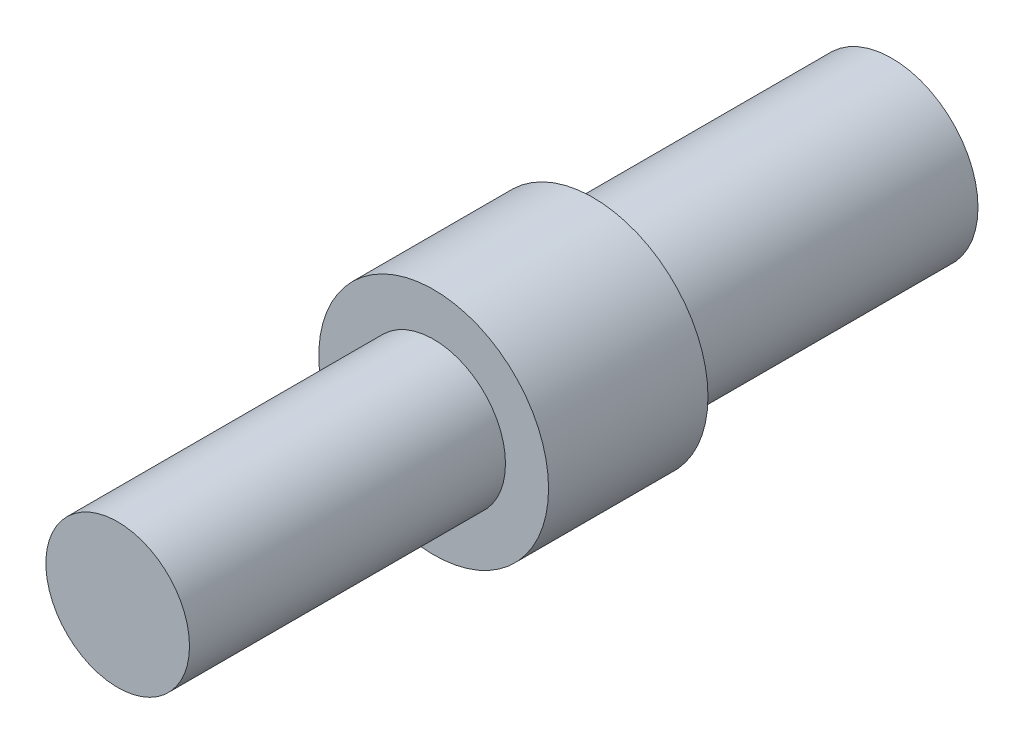
ISO-10303-21;
HEADER;
FILE_DESCRIPTION(('STEP AP214'),'2;1');
FILE_NAME('part.step','',(''),(''),'','','');
FILE_SCHEMA(('AUTOMOTIVE_DESIGN { 1 0 10303 214 1 1 1 1 }'));
ENDSEC;
DATA;
#1=APPLICATION_CONTEXT('core data for automotive mechanical design processes');
#2=APPLICATION_PROTOCOL_DEFINITION('international standard','automotive_design',2000,#1);
#3=PRODUCT_CONTEXT('',#1,'mechanical');
#4=PRODUCT('Part','Part','',(#3));
#5=PRODUCT_RELATED_PRODUCT_CATEGORY('part','',(#4));
#6=PRODUCT_DEFINITION_FORMATION('','',#4);
#7=PRODUCT_DEFINITION_CONTEXT('part definition',#1,'design');
#8=PRODUCT_DEFINITION('design','',#6,#7);
#9=PRODUCT_DEFINITION_SHAPE('','',#8);
#10=(LENGTH_UNIT() NAMED_UNIT(*) SI_UNIT(.MILLI.,.METRE.));
#11=(NAMED_UNIT(*) PLANE_ANGLE_UNIT() SI_UNIT($,.RADIAN.));
#12=(NAMED_UNIT(*) SI_UNIT($,.STERADIAN.) SOLID_ANGLE_UNIT());
#13=UNCERTAINTY_MEASURE_WITH_UNIT(LENGTH_MEASURE(1.E-05),#10,'distance_accuracy_value','');
#14=(GEOMETRIC_REPRESENTATION_CONTEXT(3) GLOBAL_UNCERTAINTY_ASSIGNED_CONTEXT((#13)) GLOBAL_UNIT_ASSIGNED_CONTEXT((#10,
#11,#12)) REPRESENTATION_CONTEXT('',''));
#15=CARTESIAN_POINT('',(0.,0.,0.));
#16=DIRECTION('',(0.,0.,1.));
#17=DIRECTION('',(1.,0.,0.));
#18=AXIS2_PLACEMENT_3D('',#15,#16,#17);
#19=CARTESIAN_POINT('',(0.,0.,20.8));
#20=DIRECTION('',(0.,0.,-1.));
#21=DIRECTION('',(-1.,0.,0.));
#22=AXIS2_PLACEMENT_3D('',#19,#20,#21);
#23=CYLINDRICAL_SURFACE('',#22,6.);
#24=CARTESIAN_POINT('',(0.,0.,20.8));
#25=DIRECTION('',(0.,0.,1.));
#26=DIRECTION('',(1.,0.,0.));
#27=AXIS2_PLACEMENT_3D('',#24,#25,#26);
#28=CIRCLE('',#27,6.);
#29=CARTESIAN_POINT('',(6.,0.,20.8));
#30=VERTEX_POINT('',#29);
#31=EDGE_CURVE('E42',#30,#30,#28,.T.);
#32=ORIENTED_EDGE('',*,*,#31,.F.);
#33=EDGE_LOOP('',(#32));
#34=FACE_BOUND('',#33,.T.);
#35=CARTESIAN_POINT('',(0.,0.,0.));
#36=DIRECTION('',(0.,0.,1.));
#37=DIRECTION('',(1.,0.,0.));
#38=AXIS2_PLACEMENT_3D('',#35,#36,#37);
#39=CIRCLE('',#38,6.);
#40=CARTESIAN_POINT('',(6.,0.,0.));
#41=VERTEX_POINT('',#40);
#42=EDGE_CURVE('E47',#41,#41,#39,.T.);
#43=ORIENTED_EDGE('',*,*,#42,.T.);
#44=EDGE_LOOP('',(#43));
#45=FACE_BOUND('',#44,.T.);
#46=ADVANCED_FACE('F40',(#34,#45),#23,.T.);
#47=CARTESIAN_POINT('',(0.,0.,0.));
#48=DIRECTION('',(0.,0.,1.));
#49=DIRECTION('',(1.,0.,0.));
#50=AXIS2_PLACEMENT_3D('',#47,#48,#49);
#51=PLANE('',#50);
#52=CARTESIAN_POINT('',(0.,0.,0.));
#53=DIRECTION('',(0.,0.,1.));
#54=DIRECTION('',(1.,0.,0.));
#55=AXIS2_PLACEMENT_3D('',#52,#53,#54);
#56=CIRCLE('',#55,2.53);
#57=CARTESIAN_POINT('',(2.53,0.,0.));
#58=VERTEX_POINT('',#57);
#59=EDGE_CURVE('E37',#58,#58,#56,.F.);
#60=ORIENTED_EDGE('',*,*,#59,.F.);
#61=EDGE_LOOP('',(#60));
#62=FACE_BOUND('',#61,.T.);
#63=ORIENTED_EDGE('',*,*,#42,.F.);
#64=EDGE_LOOP('',(#63));
#65=FACE_BOUND('',#64,.T.);
#66=ADVANCED_FACE('F61',(#62,#65),#51,.F.);
#67=CARTESIAN_POINT('',(0.,0.,31.9));
#68=DIRECTION('',(0.,0.,-1.));
#69=DIRECTION('',(-1.,0.,0.));
#70=AXIS2_PLACEMENT_3D('',#67,#68,#69);
#71=CYLINDRICAL_SURFACE('',#70,8.);
#72=CARTESIAN_POINT('',(0.,0.,31.9));
#73=DIRECTION('',(0.,0.,1.));
#74=DIRECTION('',(1.,0.,0.));
#75=AXIS2_PLACEMENT_3D('',#72,#73,#74);
#76=CIRCLE('',#75,8.);
#77=CARTESIAN_POINT('',(8.,0.,31.9));
#78=VERTEX_POINT('',#77);
#79=EDGE_CURVE('E54',#78,#78,#76,.T.);
#80=ORIENTED_EDGE('',*,*,#79,.F.);
#81=EDGE_LOOP('',(#80));
#82=FACE_BOUND('',#81,.T.);
#83=CARTESIAN_POINT('',(0.,0.,20.8));
#84=DIRECTION('',(0.,0.,1.));
#85=DIRECTION('',(1.,0.,0.));
#86=AXIS2_PLACEMENT_3D('',#83,#84,#85);
#87=CIRCLE('',#86,8.);
#88=CARTESIAN_POINT('',(8.,0.,20.8));
#89=VERTEX_POINT('',#88);
#90=EDGE_CURVE('E59',#89,#89,#87,.T.);
#91=ORIENTED_EDGE('',*,*,#90,.T.);
#92=EDGE_LOOP('',(#91));
#93=FACE_BOUND('',#92,.T.);
#94=ADVANCED_FACE('F67',(#82,#93),#71,.T.);
#95=CARTESIAN_POINT('',(0.,0.,31.9));
#96=DIRECTION('',(0.,0.,1.));
#97=DIRECTION('',(1.,0.,0.));
#98=AXIS2_PLACEMENT_3D('',#95,#96,#97);
#99=PLANE('',#98);
#100=CARTESIAN_POINT('',(0.,0.,31.9));
#101=DIRECTION('',(0.,0.,1.));
#102=DIRECTION('',(1.,0.,0.));
#103=AXIS2_PLACEMENT_3D('',#100,#101,#102);
#104=CIRCLE('',#103,5.);
#105=CARTESIAN_POINT('',(5.,0.,31.9));
#106=VERTEX_POINT('',#105);
#107=EDGE_CURVE('E10',#106,#106,#104,.T.);
#108=ORIENTED_EDGE('',*,*,#107,.F.);
#109=EDGE_LOOP('',(#108));
#110=FACE_BOUND('',#109,.T.);
#111=ORIENTED_EDGE('',*,*,#79,.T.);
#112=EDGE_LOOP('',(#111));
#113=FACE_BOUND('',#112,.T.);
#114=ADVANCED_FACE('F73',(#110,#113),#99,.T.);
#115=CARTESIAN_POINT('',(0.,0.,20.8));
#116=DIRECTION('',(0.,0.,1.));
#117=DIRECTION('',(1.,0.,0.));
#118=AXIS2_PLACEMENT_3D('',#115,#116,#117);
#119=PLANE('',#118);
#120=ORIENTED_EDGE('',*,*,#31,.T.);
#121=EDGE_LOOP('',(#120));
#122=FACE_BOUND('',#121,.T.);
#123=ORIENTED_EDGE('',*,*,#90,.F.);
#124=EDGE_LOOP('',(#123));
#125=FACE_BOUND('',#124,.T.);
#126=ADVANCED_FACE('F78',(#122,#125),#119,.F.);
#127=CARTESIAN_POINT('',(0.,0.,53.9));
#128=DIRECTION('',(0.,0.,-1.));
#129=DIRECTION('',(-1.,0.,0.));
#130=AXIS2_PLACEMENT_3D('',#127,#128,#129);
#131=CYLINDRICAL_SURFACE('',#130,5.);
#132=CARTESIAN_POINT('',(0.,0.,53.9));
#133=DIRECTION('',(0.,0.,1.));
#134=DIRECTION('',(1.,0.,0.));
#135=AXIS2_PLACEMENT_3D('',#132,#133,#134);
#136=CIRCLE('',#135,5.);
#137=CARTESIAN_POINT('',(5.,0.,53.9));
#138=VERTEX_POINT('',#137);
#139=EDGE_CURVE('E52',#138,#138,#136,.T.);
#140=ORIENTED_EDGE('',*,*,#139,.F.);
#141=EDGE_LOOP('',(#140));
#142=FACE_BOUND('',#141,.T.);
#143=ORIENTED_EDGE('',*,*,#107,.T.);
#144=EDGE_LOOP('',(#143));
#145=FACE_BOUND('',#144,.T.);
#146=ADVANCED_FACE('F84',(#142,#145),#131,.T.);
#147=CARTESIAN_POINT('',(0.,0.,53.9));
#148=DIRECTION('',(0.,0.,1.));
#149=DIRECTION('',(1.,0.,0.));
#150=AXIS2_PLACEMENT_3D('',#147,#148,#149);
#151=PLANE('',#150);
#152=ORIENTED_EDGE('',*,*,#139,.T.);
#153=EDGE_LOOP('',(#152));
#154=FACE_BOUND('',#153,.T.);
#155=ADVANCED_FACE('F88',(#154),#151,.T.);
#156=CARTESIAN_POINT('',(0.,0.,9.));
#157=DIRECTION('',(0.,0.,-1.));
#158=DIRECTION('',(-1.,0.,0.));
#159=AXIS2_PLACEMENT_3D('',#156,#157,#158);
#160=CYLINDRICAL_SURFACE('',#159,2.53);
#161=CARTESIAN_POINT('',(0.,0.,9.));
#162=DIRECTION('',(0.,0.,1.));
#163=DIRECTION('',(1.,0.,0.));
#164=AXIS2_PLACEMENT_3D('',#161,#162,#163);
#165=CIRCLE('',#164,2.53);
#166=CARTESIAN_POINT('',(2.53,0.,9.));
#167=VERTEX_POINT('',#166);
#168=EDGE_CURVE('E104',#167,#167,#165,.T.);
#169=ORIENTED_EDGE('',*,*,#168,.T.);
#170=EDGE_LOOP('',(#169));
#171=FACE_BOUND('',#170,.T.);
#172=ORIENTED_EDGE('',*,*,#59,.T.);
#173=EDGE_LOOP('',(#172));
#174=FACE_BOUND('',#173,.T.);
#175=ADVANCED_FACE('F93',(#171,#174),#160,.F.);
#176=CARTESIAN_POINT('',(0.,0.,9.));
#177=DIRECTION('',(0.,0.,1.));
#178=DIRECTION('',(1.,0.,0.));
#179=AXIS2_PLACEMENT_3D('',#176,#177,#178);
#180=PLANE('',#179);
#181=ORIENTED_EDGE('',*,*,#168,.F.);
#182=EDGE_LOOP('',(#181));
#183=FACE_BOUND('',#182,.T.);
#184=ADVANCED_FACE('F98',(#183),#180,.F.);
#185=CLOSED_SHELL('',(#46,#66,#94,#114,#126,#146,#155,#175,#184));
#186=MANIFOLD_SOLID_BREP('B2',#185);
#187=ADVANCED_BREP_SHAPE_REPRESENTATION('',(#18,#186),#14);
#188=SHAPE_DEFINITION_REPRESENTATION(#9,#187);
ENDSEC;
END-ISO-10303-21;
